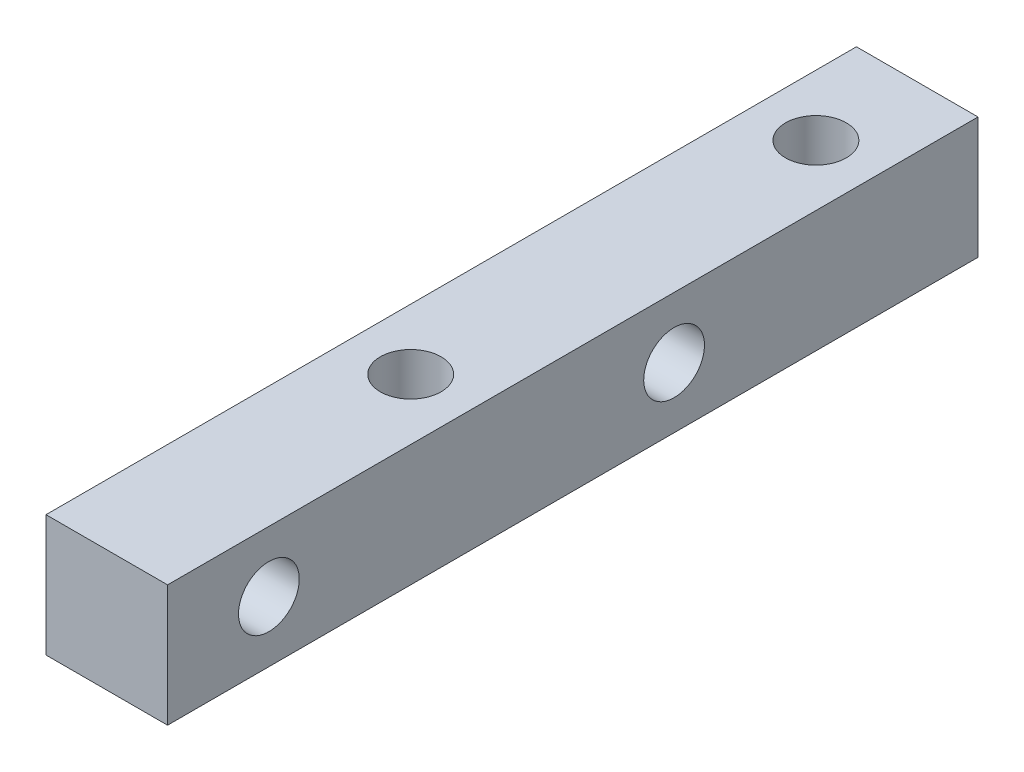
ISO-10303-21;
HEADER;
FILE_DESCRIPTION(('STEP AP214'),'2;1');
FILE_NAME('part.step','',(''),(''),'','','');
FILE_SCHEMA(('AUTOMOTIVE_DESIGN { 1 0 10303 214 1 1 1 1 }'));
ENDSEC;
DATA;
#1=APPLICATION_CONTEXT('core data for automotive mechanical design processes');
#2=APPLICATION_PROTOCOL_DEFINITION('international standard','automotive_design',2000,#1);
#3=PRODUCT_CONTEXT('',#1,'mechanical');
#4=PRODUCT('Part','Part','',(#3));
#5=PRODUCT_RELATED_PRODUCT_CATEGORY('part','',(#4));
#6=PRODUCT_DEFINITION_FORMATION('','',#4);
#7=PRODUCT_DEFINITION_CONTEXT('part definition',#1,'design');
#8=PRODUCT_DEFINITION('design','',#6,#7);
#9=PRODUCT_DEFINITION_SHAPE('','',#8);
#10=(LENGTH_UNIT() NAMED_UNIT(*) SI_UNIT(.MILLI.,.METRE.));
#11=(NAMED_UNIT(*) PLANE_ANGLE_UNIT() SI_UNIT($,.RADIAN.));
#12=(NAMED_UNIT(*) SI_UNIT($,.STERADIAN.) SOLID_ANGLE_UNIT());
#13=UNCERTAINTY_MEASURE_WITH_UNIT(LENGTH_MEASURE(1.E-05),#10,'distance_accuracy_value','');
#14=(GEOMETRIC_REPRESENTATION_CONTEXT(3) GLOBAL_UNCERTAINTY_ASSIGNED_CONTEXT((#13)) GLOBAL_UNIT_ASSIGNED_CONTEXT((#10,
#11,#12)) REPRESENTATION_CONTEXT('',''));
#15=CARTESIAN_POINT('',(0.,0.,0.));
#16=DIRECTION('',(0.,0.,1.));
#17=DIRECTION('',(1.,0.,0.));
#18=AXIS2_PLACEMENT_3D('',#15,#16,#17);
#19=CARTESIAN_POINT('',(3.,3.,20.));
#20=DIRECTION('',(-1.,0.,0.));
#21=DIRECTION('',(0.,-1.,0.));
#22=AXIS2_PLACEMENT_3D('',#19,#20,#21);
#23=PLANE('',#22);
#24=CARTESIAN_POINT('',(3.,0.,15.));
#25=DIRECTION('',(1.,0.,0.));
#26=DIRECTION('',(0.,1.,0.));
#27=AXIS2_PLACEMENT_3D('',#24,#25,#26);
#28=CIRCLE('',#27,1.5);
#29=CARTESIAN_POINT('',(3.,1.5,15.));
#30=VERTEX_POINT('',#29);
#31=EDGE_CURVE('E115',#30,#30,#28,.T.);
#32=ORIENTED_EDGE('',*,*,#31,.F.);
#33=EDGE_LOOP('',(#32));
#34=FACE_BOUND('',#33,.T.);
#35=CARTESIAN_POINT('',(3.,0.,-5.));
#36=DIRECTION('',(1.,0.,0.));
#37=DIRECTION('',(0.,1.,0.));
#38=AXIS2_PLACEMENT_3D('',#35,#36,#37);
#39=CIRCLE('',#38,1.5);
#40=CARTESIAN_POINT('',(3.,1.5,-5.));
#41=VERTEX_POINT('',#40);
#42=EDGE_CURVE('E116',#41,#41,#39,.T.);
#43=ORIENTED_EDGE('',*,*,#42,.F.);
#44=EDGE_LOOP('',(#43));
#45=FACE_BOUND('',#44,.T.);
#46=DIRECTION('',(0.,1.,0.));
#47=VECTOR('',#46,1.);
#48=CARTESIAN_POINT('',(3.,3.,-20.));
#49=LINE('',#48,#47);
#50=CARTESIAN_POINT('',(3.,-3.,-20.));
#51=VERTEX_POINT('',#50);
#52=CARTESIAN_POINT('',(3.,3.,-20.));
#53=VERTEX_POINT('',#52);
#54=EDGE_CURVE('E98',#51,#53,#49,.T.);
#55=ORIENTED_EDGE('',*,*,#54,.T.);
#56=DIRECTION('',(0.,0.,-1.));
#57=VECTOR('',#56,1.);
#58=CARTESIAN_POINT('',(3.,3.,20.));
#59=LINE('',#58,#57);
#60=CARTESIAN_POINT('',(3.,3.,20.));
#61=VERTEX_POINT('',#60);
#62=EDGE_CURVE('E11',#61,#53,#59,.T.);
#63=ORIENTED_EDGE('',*,*,#62,.F.);
#64=DIRECTION('',(0.,1.,0.));
#65=VECTOR('',#64,1.);
#66=CARTESIAN_POINT('',(3.,3.,20.));
#67=LINE('',#66,#65);
#68=CARTESIAN_POINT('',(3.,-3.,20.));
#69=VERTEX_POINT('',#68);
#70=EDGE_CURVE('E86',#69,#61,#67,.T.);
#71=ORIENTED_EDGE('',*,*,#70,.F.);
#72=DIRECTION('',(0.,0.,-1.));
#73=VECTOR('',#72,1.);
#74=CARTESIAN_POINT('',(3.,-3.,20.));
#75=LINE('',#74,#73);
#76=EDGE_CURVE('E94',#69,#51,#75,.T.);
#77=ORIENTED_EDGE('',*,*,#76,.T.);
#78=EDGE_LOOP('',(#55,#63,#71,#77));
#79=FACE_BOUND('',#78,.T.);
#80=ADVANCED_FACE('F35',(#34,#45,#79),#23,.F.);
#81=CARTESIAN_POINT('',(-3.,3.,20.));
#82=DIRECTION('',(0.,-1.,0.));
#83=DIRECTION('',(0.,0.,-1.));
#84=AXIS2_PLACEMENT_3D('',#81,#82,#83);
#85=PLANE('',#84);
#86=CARTESIAN_POINT('',(0.,3.,-15.));
#87=DIRECTION('',(0.,1.,0.));
#88=DIRECTION('',(0.,0.,1.));
#89=AXIS2_PLACEMENT_3D('',#86,#87,#88);
#90=CIRCLE('',#89,1.5);
#91=CARTESIAN_POINT('',(0.,3.,-13.5));
#92=VERTEX_POINT('',#91);
#93=EDGE_CURVE('E127',#92,#92,#90,.T.);
#94=ORIENTED_EDGE('',*,*,#93,.F.);
#95=EDGE_LOOP('',(#94));
#96=FACE_BOUND('',#95,.T.);
#97=CARTESIAN_POINT('',(0.,3.,5.));
#98=DIRECTION('',(0.,1.,0.));
#99=DIRECTION('',(0.,0.,1.));
#100=AXIS2_PLACEMENT_3D('',#97,#98,#99);
#101=CIRCLE('',#100,1.5);
#102=CARTESIAN_POINT('',(0.,3.,6.5));
#103=VERTEX_POINT('',#102);
#104=EDGE_CURVE('E128',#103,#103,#101,.T.);
#105=ORIENTED_EDGE('',*,*,#104,.F.);
#106=EDGE_LOOP('',(#105));
#107=FACE_BOUND('',#106,.T.);
#108=DIRECTION('',(-1.,0.,0.));
#109=VECTOR('',#108,1.);
#110=CARTESIAN_POINT('',(-3.,3.,-20.));
#111=LINE('',#110,#109);
#112=CARTESIAN_POINT('',(-3.,3.,-20.));
#113=VERTEX_POINT('',#112);
#114=EDGE_CURVE('E90',#53,#113,#111,.T.);
#115=ORIENTED_EDGE('',*,*,#114,.T.);
#116=DIRECTION('',(0.,0.,-1.));
#117=VECTOR('',#116,1.);
#118=CARTESIAN_POINT('',(-3.,3.,20.));
#119=LINE('',#118,#117);
#120=CARTESIAN_POINT('',(-3.,3.,20.));
#121=VERTEX_POINT('',#120);
#122=EDGE_CURVE('E43',#121,#113,#119,.T.);
#123=ORIENTED_EDGE('',*,*,#122,.F.);
#124=DIRECTION('',(-1.,0.,0.));
#125=VECTOR('',#124,1.);
#126=CARTESIAN_POINT('',(-3.,3.,20.));
#127=LINE('',#126,#125);
#128=EDGE_CURVE('E81',#61,#121,#127,.T.);
#129=ORIENTED_EDGE('',*,*,#128,.F.);
#130=ORIENTED_EDGE('',*,*,#62,.T.);
#131=EDGE_LOOP('',(#115,#123,#129,#130));
#132=FACE_BOUND('',#131,.T.);
#133=ADVANCED_FACE('F89',(#96,#107,#132),#85,.F.);
#134=CARTESIAN_POINT('',(-3.,3.,20.));
#135=DIRECTION('',(1.,0.,0.));
#136=DIRECTION('',(0.,1.,0.));
#137=AXIS2_PLACEMENT_3D('',#134,#135,#136);
#138=PLANE('',#137);
#139=CARTESIAN_POINT('',(-3.,0.,15.));
#140=DIRECTION('',(1.,0.,0.));
#141=DIRECTION('',(0.,1.,0.));
#142=AXIS2_PLACEMENT_3D('',#139,#140,#141);
#143=CIRCLE('',#142,1.5);
#144=CARTESIAN_POINT('',(-3.,1.5,15.));
#145=VERTEX_POINT('',#144);
#146=EDGE_CURVE('E101',#145,#145,#143,.F.);
#147=ORIENTED_EDGE('',*,*,#146,.F.);
#148=EDGE_LOOP('',(#147));
#149=FACE_BOUND('',#148,.T.);
#150=CARTESIAN_POINT('',(-3.,0.,-5.));
#151=DIRECTION('',(1.,0.,0.));
#152=DIRECTION('',(0.,1.,0.));
#153=AXIS2_PLACEMENT_3D('',#150,#151,#152);
#154=CIRCLE('',#153,1.5);
#155=CARTESIAN_POINT('',(-3.,1.5,-5.));
#156=VERTEX_POINT('',#155);
#157=EDGE_CURVE('E112',#156,#156,#154,.F.);
#158=ORIENTED_EDGE('',*,*,#157,.F.);
#159=EDGE_LOOP('',(#158));
#160=FACE_BOUND('',#159,.T.);
#161=DIRECTION('',(0.,-1.,0.));
#162=VECTOR('',#161,1.);
#163=CARTESIAN_POINT('',(-3.,3.,-20.));
#164=LINE('',#163,#162);
#165=CARTESIAN_POINT('',(-3.,-3.,-20.));
#166=VERTEX_POINT('',#165);
#167=EDGE_CURVE('E68',#113,#166,#164,.T.);
#168=ORIENTED_EDGE('',*,*,#167,.T.);
#169=DIRECTION('',(0.,0.,-1.));
#170=VECTOR('',#169,1.);
#171=CARTESIAN_POINT('',(-3.,-3.,20.));
#172=LINE('',#171,#170);
#173=CARTESIAN_POINT('',(-3.,-3.,20.));
#174=VERTEX_POINT('',#173);
#175=EDGE_CURVE('E91',#174,#166,#172,.T.);
#176=ORIENTED_EDGE('',*,*,#175,.F.);
#177=DIRECTION('',(0.,-1.,0.));
#178=VECTOR('',#177,1.);
#179=CARTESIAN_POINT('',(-3.,3.,20.));
#180=LINE('',#179,#178);
#181=EDGE_CURVE('E84',#121,#174,#180,.T.);
#182=ORIENTED_EDGE('',*,*,#181,.F.);
#183=ORIENTED_EDGE('',*,*,#122,.T.);
#184=EDGE_LOOP('',(#168,#176,#182,#183));
#185=FACE_BOUND('',#184,.T.);
#186=ADVANCED_FACE('F92',(#149,#160,#185),#138,.F.);
#187=CARTESIAN_POINT('',(-3.,-3.,20.));
#188=DIRECTION('',(0.,1.,0.));
#189=DIRECTION('',(0.,0.,1.));
#190=AXIS2_PLACEMENT_3D('',#187,#188,#189);
#191=PLANE('',#190);
#192=CARTESIAN_POINT('',(0.,-3.,-15.));
#193=DIRECTION('',(0.,1.,0.));
#194=DIRECTION('',(0.,0.,1.));
#195=AXIS2_PLACEMENT_3D('',#192,#193,#194);
#196=CIRCLE('',#195,1.5);
#197=CARTESIAN_POINT('',(0.,-3.,-13.5));
#198=VERTEX_POINT('',#197);
#199=EDGE_CURVE('E119',#198,#198,#196,.F.);
#200=ORIENTED_EDGE('',*,*,#199,.F.);
#201=EDGE_LOOP('',(#200));
#202=FACE_BOUND('',#201,.T.);
#203=CARTESIAN_POINT('',(0.,-3.,5.));
#204=DIRECTION('',(0.,1.,0.));
#205=DIRECTION('',(0.,0.,1.));
#206=AXIS2_PLACEMENT_3D('',#203,#204,#205);
#207=CIRCLE('',#206,1.5);
#208=CARTESIAN_POINT('',(0.,-3.,6.5));
#209=VERTEX_POINT('',#208);
#210=EDGE_CURVE('E124',#209,#209,#207,.F.);
#211=ORIENTED_EDGE('',*,*,#210,.F.);
#212=EDGE_LOOP('',(#211));
#213=FACE_BOUND('',#212,.T.);
#214=DIRECTION('',(1.,0.,0.));
#215=VECTOR('',#214,1.);
#216=CARTESIAN_POINT('',(-3.,-3.,-20.));
#217=LINE('',#216,#215);
#218=EDGE_CURVE('E74',#166,#51,#217,.T.);
#219=ORIENTED_EDGE('',*,*,#218,.T.);
#220=ORIENTED_EDGE('',*,*,#76,.F.);
#221=DIRECTION('',(1.,0.,0.));
#222=VECTOR('',#221,1.);
#223=CARTESIAN_POINT('',(-3.,-3.,20.));
#224=LINE('',#223,#222);
#225=EDGE_CURVE('E51',#174,#69,#224,.T.);
#226=ORIENTED_EDGE('',*,*,#225,.F.);
#227=ORIENTED_EDGE('',*,*,#175,.T.);
#228=EDGE_LOOP('',(#219,#220,#226,#227));
#229=FACE_BOUND('',#228,.T.);
#230=ADVANCED_FACE('F106',(#202,#213,#229),#191,.F.);
#231=CARTESIAN_POINT('',(0.,0.,20.));
#232=DIRECTION('',(0.,0.,1.));
#233=DIRECTION('',(1.,0.,0.));
#234=AXIS2_PLACEMENT_3D('',#231,#232,#233);
#235=PLANE('',#234);
#236=ORIENTED_EDGE('',*,*,#70,.T.);
#237=ORIENTED_EDGE('',*,*,#128,.T.);
#238=ORIENTED_EDGE('',*,*,#181,.T.);
#239=ORIENTED_EDGE('',*,*,#225,.T.);
#240=EDGE_LOOP('',(#236,#237,#238,#239));
#241=FACE_BOUND('',#240,.T.);
#242=ADVANCED_FACE('F82',(#241),#235,.T.);
#243=CARTESIAN_POINT('',(0.,0.,-20.));
#244=DIRECTION('',(0.,0.,1.));
#245=DIRECTION('',(1.,0.,0.));
#246=AXIS2_PLACEMENT_3D('',#243,#244,#245);
#247=PLANE('',#246);
#248=ORIENTED_EDGE('',*,*,#54,.F.);
#249=ORIENTED_EDGE('',*,*,#218,.F.);
#250=ORIENTED_EDGE('',*,*,#167,.F.);
#251=ORIENTED_EDGE('',*,*,#114,.F.);
#252=EDGE_LOOP('',(#248,#249,#250,#251));
#253=FACE_BOUND('',#252,.T.);
#254=ADVANCED_FACE('F109',(#253),#247,.F.);
#255=CARTESIAN_POINT('',(-3.001,0.,-5.));
#256=DIRECTION('',(1.,0.,0.));
#257=DIRECTION('',(0.,1.,0.));
#258=AXIS2_PLACEMENT_3D('',#255,#256,#257);
#259=CYLINDRICAL_SURFACE('',#258,1.5);
#260=ORIENTED_EDGE('',*,*,#42,.T.);
#261=EDGE_LOOP('',(#260));
#262=FACE_BOUND('',#261,.T.);
#263=ORIENTED_EDGE('',*,*,#157,.T.);
#264=EDGE_LOOP('',(#263));
#265=FACE_BOUND('',#264,.T.);
#266=ADVANCED_FACE('F170',(#262,#265),#259,.F.);
#267=CARTESIAN_POINT('',(-3.001,0.,15.));
#268=DIRECTION('',(1.,0.,0.));
#269=DIRECTION('',(0.,1.,0.));
#270=AXIS2_PLACEMENT_3D('',#267,#268,#269);
#271=CYLINDRICAL_SURFACE('',#270,1.5);
#272=ORIENTED_EDGE('',*,*,#31,.T.);
#273=EDGE_LOOP('',(#272));
#274=FACE_BOUND('',#273,.T.);
#275=ORIENTED_EDGE('',*,*,#146,.T.);
#276=EDGE_LOOP('',(#275));
#277=FACE_BOUND('',#276,.T.);
#278=ADVANCED_FACE('F146',(#274,#277),#271,.F.);
#279=CARTESIAN_POINT('',(0.,-3.001,5.));
#280=DIRECTION('',(0.,1.,0.));
#281=DIRECTION('',(0.,0.,1.));
#282=AXIS2_PLACEMENT_3D('',#279,#280,#281);
#283=CYLINDRICAL_SURFACE('',#282,1.5);
#284=CARTESIAN_POINT('',(0.,3.,6.5));
#285=CARTESIAN_POINT('',(0.,2.9375,6.5));
#286=CARTESIAN_POINT('',(0.,2.875,6.5));
#287=CARTESIAN_POINT('',(0.,2.75,6.5));
#288=CARTESIAN_POINT('',(0.,2.6875,6.5));
#289=CARTESIAN_POINT('',(0.,2.5625,6.5));
#290=CARTESIAN_POINT('',(0.,2.5,6.5));
#291=CARTESIAN_POINT('',(0.,2.375,6.5));
#292=CARTESIAN_POINT('',(0.,2.3125,6.5));
#293=CARTESIAN_POINT('',(0.,2.1875,6.5));
#294=CARTESIAN_POINT('',(0.,2.125,6.5));
#295=CARTESIAN_POINT('',(0.,2.,6.5));
#296=CARTESIAN_POINT('',(0.,1.9375,6.5));
#297=CARTESIAN_POINT('',(0.,1.8125,6.5));
#298=CARTESIAN_POINT('',(0.,1.75,6.5));
#299=CARTESIAN_POINT('',(0.,1.625,6.5));
#300=CARTESIAN_POINT('',(0.,1.5625,6.5));
#301=CARTESIAN_POINT('',(0.,1.4375,6.5));
#302=CARTESIAN_POINT('',(0.,1.375,6.5));
#303=CARTESIAN_POINT('',(0.,1.25,6.5));
#304=CARTESIAN_POINT('',(0.,1.1875,6.5));
#305=CARTESIAN_POINT('',(0.,1.0625,6.5));
#306=CARTESIAN_POINT('',(0.,1.,6.5));
#307=CARTESIAN_POINT('',(0.,0.875,6.5));
#308=CARTESIAN_POINT('',(0.,0.8125,6.5));
#309=CARTESIAN_POINT('',(0.,0.6875,6.5));
#310=CARTESIAN_POINT('',(0.,0.625,6.5));
#311=CARTESIAN_POINT('',(0.,0.5,6.5));
#312=CARTESIAN_POINT('',(0.,0.4375,6.5));
#313=CARTESIAN_POINT('',(0.,0.3125,6.5));
#314=CARTESIAN_POINT('',(0.,0.25,6.5));
#315=CARTESIAN_POINT('',(0.,0.125,6.5));
#316=CARTESIAN_POINT('',(0.,0.0625,6.5));
#317=CARTESIAN_POINT('',(0.,-0.0625,6.5));
#318=CARTESIAN_POINT('',(0.,-0.125,6.5));
#319=CARTESIAN_POINT('',(0.,-0.25,6.5));
#320=CARTESIAN_POINT('',(0.,-0.3125,6.5));
#321=CARTESIAN_POINT('',(0.,-0.4375,6.5));
#322=CARTESIAN_POINT('',(0.,-0.5,6.5));
#323=CARTESIAN_POINT('',(0.,-0.625,6.5));
#324=CARTESIAN_POINT('',(0.,-0.6875,6.5));
#325=CARTESIAN_POINT('',(0.,-0.8125,6.5));
#326=CARTESIAN_POINT('',(0.,-0.875,6.5));
#327=CARTESIAN_POINT('',(0.,-1.,6.5));
#328=CARTESIAN_POINT('',(0.,-1.0625,6.5));
#329=CARTESIAN_POINT('',(0.,-1.1875,6.5));
#330=CARTESIAN_POINT('',(0.,-1.25,6.5));
#331=CARTESIAN_POINT('',(0.,-1.375,6.5));
#332=CARTESIAN_POINT('',(0.,-1.4375,6.5));
#333=CARTESIAN_POINT('',(0.,-1.5625,6.5));
#334=CARTESIAN_POINT('',(0.,-1.625,6.5));
#335=CARTESIAN_POINT('',(0.,-1.75,6.5));
#336=CARTESIAN_POINT('',(0.,-1.8125,6.5));
#337=CARTESIAN_POINT('',(0.,-1.9375,6.5));
#338=CARTESIAN_POINT('',(0.,-2.,6.5));
#339=CARTESIAN_POINT('',(0.,-2.125,6.5));
#340=CARTESIAN_POINT('',(0.,-2.1875,6.5));
#341=CARTESIAN_POINT('',(0.,-2.3125,6.5));
#342=CARTESIAN_POINT('',(0.,-2.375,6.5));
#343=CARTESIAN_POINT('',(0.,-2.5,6.5));
#344=CARTESIAN_POINT('',(0.,-2.5625,6.5));
#345=CARTESIAN_POINT('',(0.,-2.6875,6.5));
#346=CARTESIAN_POINT('',(0.,-2.75,6.5));
#347=CARTESIAN_POINT('',(0.,-2.875,6.5));
#348=CARTESIAN_POINT('',(0.,-2.9375,6.5));
#349=CARTESIAN_POINT('',(0.,-3.,6.5));
#350=B_SPLINE_CURVE_WITH_KNOTS('',3,(#284,#285,#286,#287,#288,#289,#290,#291,#292,#293,#294,
#295,#296,#297,#298,#299,#300,#301,#302,#303,#304,#305,#306,#307,#308,#309,#310,#311,#312,#313,
#314,#315,#316,#317,#318,#319,#320,#321,#322,#323,#324,#325,#326,#327,#328,#329,#330,#331,#332,
#333,#334,#335,#336,#337,#338,#339,#340,#341,#342,#343,#344,#345,#346,#347,#348,#349),
.UNSPECIFIED.,.F.,.F.,(4,2,2,2,2,2,2,2,2,2,2,2,2,2,2,2,2,2,2,2,2,2,2,2,2,2,2,2,2,2,2,2,4),(0.,
0.1875,0.375,0.5625,0.75,0.9375,1.125,1.3125,1.5,1.6875,1.875,2.0625,2.25,2.4375,2.625,2.8125,
3.,3.1875,3.375,3.5625,3.75,3.9375,4.125,4.3125,4.5,4.6875,4.875,5.0625,5.25,5.4375,5.625,
5.8125,6.),.UNSPECIFIED.);
#351=EDGE_CURVE('BSEAM143',#103,#209,#350,.T.);
#352=ORIENTED_EDGE('',*,*,#104,.T.);
#353=ORIENTED_EDGE('',*,*,#210,.T.);
#354=ORIENTED_EDGE('',*,*,#351,.T.);
#355=ORIENTED_EDGE('',*,*,#351,.F.);
#356=EDGE_LOOP('',(#352,#354,#353,#355));
#357=FACE_BOUND('',#356,.T.);
#358=ADVANCED_FACE('F143',(#357),#283,.F.);
#359=CARTESIAN_POINT('',(0.,-3.001,-15.));
#360=DIRECTION('',(0.,1.,0.));
#361=DIRECTION('',(0.,0.,1.));
#362=AXIS2_PLACEMENT_3D('',#359,#360,#361);
#363=CYLINDRICAL_SURFACE('',#362,1.5);
#364=CARTESIAN_POINT('',(0.,3.,-13.5));
#365=CARTESIAN_POINT('',(0.,2.9375,-13.5));
#366=CARTESIAN_POINT('',(0.,2.875,-13.5));
#367=CARTESIAN_POINT('',(0.,2.75,-13.5));
#368=CARTESIAN_POINT('',(0.,2.6875,-13.5));
#369=CARTESIAN_POINT('',(0.,2.5625,-13.5));
#370=CARTESIAN_POINT('',(0.,2.5,-13.5));
#371=CARTESIAN_POINT('',(0.,2.375,-13.5));
#372=CARTESIAN_POINT('',(0.,2.3125,-13.5));
#373=CARTESIAN_POINT('',(0.,2.1875,-13.5));
#374=CARTESIAN_POINT('',(0.,2.125,-13.5));
#375=CARTESIAN_POINT('',(0.,2.,-13.5));
#376=CARTESIAN_POINT('',(0.,1.9375,-13.5));
#377=CARTESIAN_POINT('',(0.,1.8125,-13.5));
#378=CARTESIAN_POINT('',(0.,1.75,-13.5));
#379=CARTESIAN_POINT('',(0.,1.625,-13.5));
#380=CARTESIAN_POINT('',(0.,1.5625,-13.5));
#381=CARTESIAN_POINT('',(0.,1.4375,-13.5));
#382=CARTESIAN_POINT('',(0.,1.375,-13.5));
#383=CARTESIAN_POINT('',(0.,1.25,-13.5));
#384=CARTESIAN_POINT('',(0.,1.1875,-13.5));
#385=CARTESIAN_POINT('',(0.,1.0625,-13.5));
#386=CARTESIAN_POINT('',(0.,1.,-13.5));
#387=CARTESIAN_POINT('',(0.,0.875,-13.5));
#388=CARTESIAN_POINT('',(0.,0.8125,-13.5));
#389=CARTESIAN_POINT('',(0.,0.6875,-13.5));
#390=CARTESIAN_POINT('',(0.,0.625,-13.5));
#391=CARTESIAN_POINT('',(0.,0.5,-13.5));
#392=CARTESIAN_POINT('',(0.,0.4375,-13.5));
#393=CARTESIAN_POINT('',(0.,0.3125,-13.5));
#394=CARTESIAN_POINT('',(0.,0.25,-13.5));
#395=CARTESIAN_POINT('',(0.,0.125,-13.5));
#396=CARTESIAN_POINT('',(0.,0.0625,-13.5));
#397=CARTESIAN_POINT('',(0.,-0.0625,-13.5));
#398=CARTESIAN_POINT('',(0.,-0.125,-13.5));
#399=CARTESIAN_POINT('',(0.,-0.25,-13.5));
#400=CARTESIAN_POINT('',(0.,-0.3125,-13.5));
#401=CARTESIAN_POINT('',(0.,-0.4375,-13.5));
#402=CARTESIAN_POINT('',(0.,-0.5,-13.5));
#403=CARTESIAN_POINT('',(0.,-0.625,-13.5));
#404=CARTESIAN_POINT('',(0.,-0.6875,-13.5));
#405=CARTESIAN_POINT('',(0.,-0.8125,-13.5));
#406=CARTESIAN_POINT('',(0.,-0.875,-13.5));
#407=CARTESIAN_POINT('',(0.,-1.,-13.5));
#408=CARTESIAN_POINT('',(0.,-1.0625,-13.5));
#409=CARTESIAN_POINT('',(0.,-1.1875,-13.5));
#410=CARTESIAN_POINT('',(0.,-1.25,-13.5));
#411=CARTESIAN_POINT('',(0.,-1.375,-13.5));
#412=CARTESIAN_POINT('',(0.,-1.4375,-13.5));
#413=CARTESIAN_POINT('',(0.,-1.5625,-13.5));
#414=CARTESIAN_POINT('',(0.,-1.625,-13.5));
#415=CARTESIAN_POINT('',(0.,-1.75,-13.5));
#416=CARTESIAN_POINT('',(0.,-1.8125,-13.5));
#417=CARTESIAN_POINT('',(0.,-1.9375,-13.5));
#418=CARTESIAN_POINT('',(0.,-2.,-13.5));
#419=CARTESIAN_POINT('',(0.,-2.125,-13.5));
#420=CARTESIAN_POINT('',(0.,-2.1875,-13.5));
#421=CARTESIAN_POINT('',(0.,-2.3125,-13.5));
#422=CARTESIAN_POINT('',(0.,-2.375,-13.5));
#423=CARTESIAN_POINT('',(0.,-2.5,-13.5));
#424=CARTESIAN_POINT('',(0.,-2.5625,-13.5));
#425=CARTESIAN_POINT('',(0.,-2.6875,-13.5));
#426=CARTESIAN_POINT('',(0.,-2.75,-13.5));
#427=CARTESIAN_POINT('',(0.,-2.875,-13.5));
#428=CARTESIAN_POINT('',(0.,-2.9375,-13.5));
#429=CARTESIAN_POINT('',(0.,-3.,-13.5));
#430=B_SPLINE_CURVE_WITH_KNOTS('',3,(#364,#365,#366,#367,#368,#369,#370,#371,#372,#373,#374,
#375,#376,#377,#378,#379,#380,#381,#382,#383,#384,#385,#386,#387,#388,#389,#390,#391,#392,#393,
#394,#395,#396,#397,#398,#399,#400,#401,#402,#403,#404,#405,#406,#407,#408,#409,#410,#411,#412,
#413,#414,#415,#416,#417,#418,#419,#420,#421,#422,#423,#424,#425,#426,#427,#428,#429),
.UNSPECIFIED.,.F.,.F.,(4,2,2,2,2,2,2,2,2,2,2,2,2,2,2,2,2,2,2,2,2,2,2,2,2,2,2,2,2,2,2,2,4),(0.,
0.1875,0.375,0.5625,0.75,0.9375,1.125,1.3125,1.5,1.6875,1.875,2.0625,2.25,2.4375,2.625,2.8125,
3.,3.1875,3.375,3.5625,3.75,3.9375,4.125,4.3125,4.5,4.6875,4.875,5.0625,5.25,5.4375,5.625,
5.8125,6.),.UNSPECIFIED.);
#431=EDGE_CURVE('BSEAM136',#92,#198,#430,.T.);
#432=ORIENTED_EDGE('',*,*,#93,.T.);
#433=ORIENTED_EDGE('',*,*,#199,.T.);
#434=ORIENTED_EDGE('',*,*,#431,.T.);
#435=ORIENTED_EDGE('',*,*,#431,.F.);
#436=EDGE_LOOP('',(#432,#434,#433,#435));
#437=FACE_BOUND('',#436,.T.);
#438=ADVANCED_FACE('F136',(#437),#363,.F.);
#439=CLOSED_SHELL('',(#80,#133,#186,#230,#242,#254,#266,#278,#358,#438));
#440=MANIFOLD_SOLID_BREP('B2',#439);
#441=ADVANCED_BREP_SHAPE_REPRESENTATION('',(#18,#440),#14);
#442=SHAPE_DEFINITION_REPRESENTATION(#9,#441);
ENDSEC;
END-ISO-10303-21;
